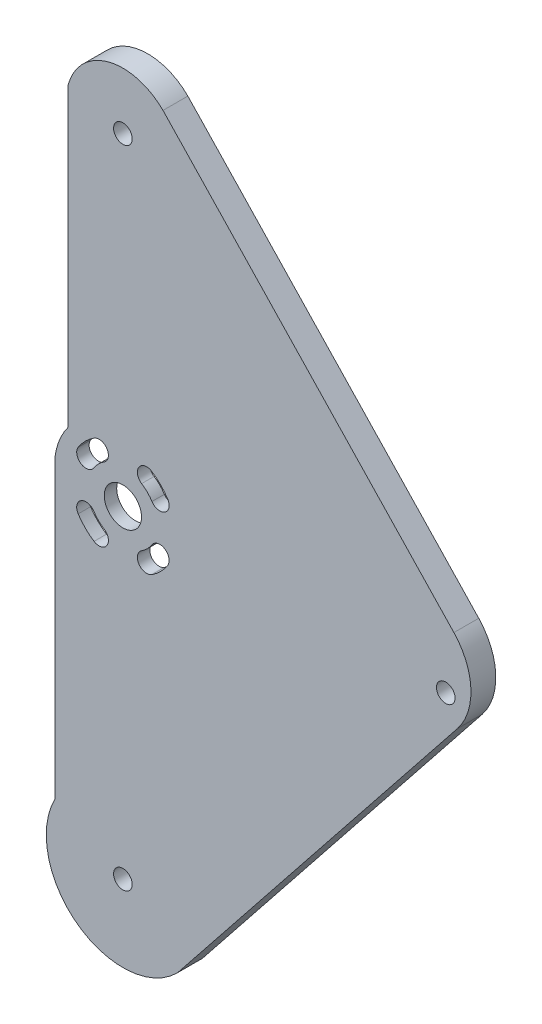
ISO-10303-21;
HEADER;
FILE_DESCRIPTION(('STEP AP214'),'2;1');
FILE_NAME('part.step','',(''),(''),'','','');
FILE_SCHEMA(('AUTOMOTIVE_DESIGN { 1 0 10303 214 1 1 1 1 }'));
ENDSEC;
DATA;
#1=APPLICATION_CONTEXT('core data for automotive mechanical design processes');
#2=APPLICATION_PROTOCOL_DEFINITION('international standard','automotive_design',2000,#1);
#3=PRODUCT_CONTEXT('',#1,'mechanical');
#4=PRODUCT('Part','Part','',(#3));
#5=PRODUCT_RELATED_PRODUCT_CATEGORY('part','',(#4));
#6=PRODUCT_DEFINITION_FORMATION('','',#4);
#7=PRODUCT_DEFINITION_CONTEXT('part definition',#1,'design');
#8=PRODUCT_DEFINITION('design','',#6,#7);
#9=PRODUCT_DEFINITION_SHAPE('','',#8);
#10=(LENGTH_UNIT() NAMED_UNIT(*) SI_UNIT(.MILLI.,.METRE.));
#11=(NAMED_UNIT(*) PLANE_ANGLE_UNIT() SI_UNIT($,.RADIAN.));
#12=(NAMED_UNIT(*) SI_UNIT($,.STERADIAN.) SOLID_ANGLE_UNIT());
#13=UNCERTAINTY_MEASURE_WITH_UNIT(LENGTH_MEASURE(1.E-05),#10,'distance_accuracy_value','');
#14=(GEOMETRIC_REPRESENTATION_CONTEXT(3) GLOBAL_UNCERTAINTY_ASSIGNED_CONTEXT((#13)) GLOBAL_UNIT_ASSIGNED_CONTEXT((#10,
#11,#12)) REPRESENTATION_CONTEXT('',''));
#15=CARTESIAN_POINT('',(0.,0.,0.));
#16=DIRECTION('',(0.,0.,1.));
#17=DIRECTION('',(1.,0.,0.));
#18=AXIS2_PLACEMENT_3D('',#15,#16,#17);
#19=CARTESIAN_POINT('',(1800.79736778428,1508.01201199318,0.));
#20=DIRECTION('',(0.,0.,1.));
#21=DIRECTION('',(1.,0.,0.));
#22=AXIS2_PLACEMENT_3D('',#19,#20,#21);
#23=PLANE('',#22);
#24=CARTESIAN_POINT('',(1800.79736778428,1508.01201199318,0.));
#25=DIRECTION('',(0.,0.,1.));
#26=DIRECTION('',(1.,0.,0.));
#27=AXIS2_PLACEMENT_3D('',#24,#25,#26);
#28=CIRCLE('',#27,1.50000000000011);
#29=CARTESIAN_POINT('',(1802.29736778428,1508.01201199318,0.));
#30=VERTEX_POINT('',#29);
#31=EDGE_CURVE('E520',#30,#30,#28,.T.);
#32=ORIENTED_EDGE('',*,*,#31,.T.);
#33=EDGE_LOOP('',(#32));
#34=FACE_BOUND('',#33,.T.);
#35=CARTESIAN_POINT('',(1852.79736778428,1560.01201199318,0.));
#36=DIRECTION('',(0.,0.,1.));
#37=DIRECTION('',(1.,0.,0.));
#38=AXIS2_PLACEMENT_3D('',#35,#36,#37);
#39=CIRCLE('',#38,1.50000000000011);
#40=CARTESIAN_POINT('',(1854.29736778428,1560.01201199318,0.));
#41=VERTEX_POINT('',#40);
#42=EDGE_CURVE('E525',#41,#41,#39,.T.);
#43=ORIENTED_EDGE('',*,*,#42,.T.);
#44=EDGE_LOOP('',(#43));
#45=FACE_BOUND('',#44,.T.);
#46=CARTESIAN_POINT('',(1800.79736778428,1612.01201199318,0.));
#47=DIRECTION('',(0.,0.,1.));
#48=DIRECTION('',(1.,0.,0.));
#49=AXIS2_PLACEMENT_3D('',#46,#47,#48);
#50=CIRCLE('',#49,1.50000000000011);
#51=CARTESIAN_POINT('',(1802.29736778428,1612.01201199318,0.));
#52=VERTEX_POINT('',#51);
#53=EDGE_CURVE('E530',#52,#52,#50,.T.);
#54=ORIENTED_EDGE('',*,*,#53,.T.);
#55=EDGE_LOOP('',(#54));
#56=FACE_BOUND('',#55,.T.);
#57=DIRECTION('',(-0.688099460960638,0.72561638062111,0.));
#58=VECTOR('',#57,1.);
#59=CARTESIAN_POINT('',(1807.2571027578,1618.4717469667,0.));
#60=LINE('',#59,#58);
#61=CARTESIAN_POINT('',(1854.11125712846,1569.0629858204,0.));
#62=VERTEX_POINT('',#61);
#63=CARTESIAN_POINT('',(1807.2571027578,1618.4717469667,0.));
#64=VERTEX_POINT('',#63);
#65=EDGE_CURVE('E251',#62,#64,#60,.T.);
#66=ORIENTED_EDGE('',*,*,#65,.F.);
#67=CARTESIAN_POINT('',(1846.85509332225,1562.1819912108,0.));
#68=DIRECTION('',(0.,0.,1.));
#69=DIRECTION('',(1.,0.,0.));
#70=AXIS2_PLACEMENT_3D('',#67,#68,#69);
#71=CIRCLE('',#70,10.);
#72=CARTESIAN_POINT('',(1854.67708205086,1555.95170290851,0.));
#73=VERTEX_POINT('',#72);
#74=EDGE_CURVE('E66',#62,#73,#71,.F.);
#75=ORIENTED_EDGE('',*,*,#74,.T.);
#76=DIRECTION('',(0.623028830228245,0.78219887286062,0.));
#77=VECTOR('',#76,1.);
#78=CARTESIAN_POINT('',(1860.09466038913,1562.75335230936,0.));
#79=LINE('',#78,#77);
#80=CARTESIAN_POINT('',(1809.60815906997,1499.36867007555,0.));
#81=VERTEX_POINT('',#80);
#82=EDGE_CURVE('E321',#81,#73,#79,.T.);
#83=ORIENTED_EDGE('',*,*,#82,.F.);
#84=CARTESIAN_POINT('',(1800.79736778428,1508.01201199318,0.));
#85=DIRECTION('',(0.,0.,1.));
#86=DIRECTION('',(1.,0.,0.));
#87=AXIS2_PLACEMENT_3D('',#84,#85,#86);
#88=CIRCLE('',#87,12.3425039025774);
#89=CARTESIAN_POINT('',(1789.87151518898,1513.75336615843,0.));
#90=VERTEX_POINT('',#89);
#91=EDGE_CURVE('E253',#90,#81,#88,.T.);
#92=ORIENTED_EDGE('',*,*,#91,.F.);
#93=DIRECTION('',(0.,-1.,0.));
#94=VECTOR('',#93,1.);
#95=CARTESIAN_POINT('',(1789.87151518898,1561.50820015436,0.));
#96=LINE('',#95,#94);
#97=CARTESIAN_POINT('',(1789.87151518898,1552.9674577088,0.));
#98=VERTEX_POINT('',#97);
#99=EDGE_CURVE('E236',#98,#90,#96,.T.);
#100=ORIENTED_EDGE('',*,*,#99,.F.);
#101=CARTESIAN_POINT('',(1800.79736778428,1560.01201199318,0.));
#102=DIRECTION('',(0.,0.,-1.));
#103=DIRECTION('',(-1.,0.,0.));
#104=AXIS2_PLACEMENT_3D('',#101,#102,#103);
#105=CIRCLE('',#104,12.9999999999998);
#106=CARTESIAN_POINT('',(1791.97511105901,1569.5601943476,0.));
#107=VERTEX_POINT('',#106);
#108=EDGE_CURVE('E224',#107,#98,#105,.T.);
#109=ORIENTED_EDGE('',*,*,#108,.F.);
#110=DIRECTION('',(0.,-1.,0.));
#111=VECTOR('',#110,1.);
#112=CARTESIAN_POINT('',(1791.97511105901,1614.38353853308,0.));
#113=LINE('',#112,#111);
#114=CARTESIAN_POINT('',(1791.97511105901,1614.38353853308,0.));
#115=VERTEX_POINT('',#114);
#116=EDGE_CURVE('E237',#115,#107,#113,.T.);
#117=ORIENTED_EDGE('',*,*,#116,.F.);
#118=CARTESIAN_POINT('',(1800.79736778428,1612.01201199318,0.));
#119=DIRECTION('',(0.,0.,1.));
#120=DIRECTION('',(1.,0.,0.));
#121=AXIS2_PLACEMENT_3D('',#118,#119,#120);
#122=CIRCLE('',#121,9.13544480888525);
#123=EDGE_CURVE('E250',#64,#115,#122,.T.);
#124=ORIENTED_EDGE('',*,*,#123,.F.);
#125=EDGE_LOOP('',(#66,#75,#83,#92,#100,#109,#117,#124));
#126=FACE_BOUND('',#125,.T.);
#127=ADVANCED_FACE('F44',(#34,#45,#56,#126),#23,.F.);
#128=CARTESIAN_POINT('',(1800.79736778428,1560.01201199318,4.));
#129=DIRECTION('',(0.,0.,-1.));
#130=DIRECTION('',(-1.,0.,0.));
#131=AXIS2_PLACEMENT_3D('',#128,#129,#130);
#132=CYLINDRICAL_SURFACE('',#131,11.0278209065997);
#133=CARTESIAN_POINT('',(1800.79736778428,1560.01201199318,2.));
#134=DIRECTION('',(0.,0.,-1.));
#135=DIRECTION('',(-1.,0.,0.));
#136=AXIS2_PLACEMENT_3D('',#133,#134,#135);
#137=CIRCLE('',#136,11.0278209065997);
#138=CARTESIAN_POINT('',(1789.87151518898,1561.50820015436,2.));
#139=VERTEX_POINT('',#138);
#140=CARTESIAN_POINT('',(1791.97511105901,1566.62870453714,2.));
#141=VERTEX_POINT('',#140);
#142=EDGE_CURVE('E386',#139,#141,#137,.T.);
#143=ORIENTED_EDGE('',*,*,#142,.F.);
#144=DIRECTION('',(0.,0.,-1.));
#145=VECTOR('',#144,1.);
#146=CARTESIAN_POINT('',(1789.87151518898,1561.50820015436,4.));
#147=LINE('',#146,#145);
#148=CARTESIAN_POINT('',(1789.87151518898,1561.50820015436,4.));
#149=VERTEX_POINT('',#148);
#150=EDGE_CURVE('E267',#149,#139,#147,.T.);
#151=ORIENTED_EDGE('',*,*,#150,.F.);
#152=CARTESIAN_POINT('',(1800.79736778428,1560.01201199318,4.));
#153=DIRECTION('',(0.,0.,1.));
#154=DIRECTION('',(1.,0.,0.));
#155=AXIS2_PLACEMENT_3D('',#152,#153,#154);
#156=CIRCLE('',#155,11.0278209065997);
#157=CARTESIAN_POINT('',(1791.97511105901,1566.62870453714,4.));
#158=VERTEX_POINT('',#157);
#159=EDGE_CURVE('E303',#158,#149,#156,.T.);
#160=ORIENTED_EDGE('',*,*,#159,.F.);
#161=DIRECTION('',(0.,0.,-1.));
#162=VECTOR('',#161,1.);
#163=CARTESIAN_POINT('',(1791.97511105901,1566.62870453714,4.));
#164=LINE('',#163,#162);
#165=EDGE_CURVE('E272',#158,#141,#164,.T.);
#166=ORIENTED_EDGE('',*,*,#165,.T.);
#167=EDGE_LOOP('',(#143,#151,#160,#166));
#168=FACE_BOUND('',#167,.T.);
#169=ADVANCED_FACE('F342',(#168),#132,.T.);
#170=CARTESIAN_POINT('',(1800.79736778428,1560.01201199318,4.));
#171=DIRECTION('',(0.,0.,-1.));
#172=DIRECTION('',(-1.,0.,0.));
#173=AXIS2_PLACEMENT_3D('',#170,#171,#172);
#174=CYLINDRICAL_SURFACE('',#173,2.99999999999994);
#175=CARTESIAN_POINT('',(1800.79736778428,1560.01201199318,4.));
#176=DIRECTION('',(0.,0.,1.));
#177=DIRECTION('',(1.,0.,0.));
#178=AXIS2_PLACEMENT_3D('',#175,#176,#177);
#179=CIRCLE('',#178,2.99999999999994);
#180=CARTESIAN_POINT('',(1803.79736778428,1560.01201199318,4.));
#181=VERTEX_POINT('',#180);
#182=EDGE_CURVE('E318',#181,#181,#179,.T.);
#183=ORIENTED_EDGE('',*,*,#182,.T.);
#184=EDGE_LOOP('',(#183));
#185=FACE_BOUND('',#184,.T.);
#186=CARTESIAN_POINT('',(1800.79736778428,1560.01201199318,2.));
#187=DIRECTION('',(0.,0.,-1.));
#188=DIRECTION('',(-1.,0.,0.));
#189=AXIS2_PLACEMENT_3D('',#186,#187,#188);
#190=CIRCLE('',#189,2.99999999999994);
#191=CARTESIAN_POINT('',(1797.79736778428,1560.01201199318,2.));
#192=VERTEX_POINT('',#191);
#193=EDGE_CURVE('E388',#192,#192,#190,.T.);
#194=ORIENTED_EDGE('',*,*,#193,.T.);
#195=EDGE_LOOP('',(#194));
#196=FACE_BOUND('',#195,.T.);
#197=ADVANCED_FACE('F355',(#185,#196),#174,.F.);
#198=CARTESIAN_POINT('',(1804.630190701,1554.0698349099,4.));
#199=DIRECTION('',(0.,0.,-1.));
#200=DIRECTION('',(-1.,0.,0.));
#201=AXIS2_PLACEMENT_3D('',#198,#199,#200);
#202=CYLINDRICAL_SURFACE('',#201,1.49999999999997);
#203=DIRECTION('',(0.,0.,-1.));
#204=VECTOR('',#203,1.);
#205=CARTESIAN_POINT('',(1805.44325522365,1552.80930879672,4.));
#206=LINE('',#205,#204);
#207=CARTESIAN_POINT('',(1805.44325522365,1552.80930879672,4.));
#208=VERTEX_POINT('',#207);
#209=CARTESIAN_POINT('',(1805.44325522365,1552.80930879672,2.));
#210=VERTEX_POINT('',#209);
#211=EDGE_CURVE('E511',#208,#210,#206,.T.);
#212=ORIENTED_EDGE('',*,*,#211,.T.);
#213=CARTESIAN_POINT('',(1804.630190701,1554.0698349099,2.));
#214=DIRECTION('',(0.,0.,-1.));
#215=DIRECTION('',(-1.,0.,0.));
#216=AXIS2_PLACEMENT_3D('',#213,#214,#215);
#217=CIRCLE('',#216,1.49999999999997);
#218=CARTESIAN_POINT('',(1803.81712617835,1555.33036102308,2.));
#219=VERTEX_POINT('',#218);
#220=EDGE_CURVE('E398',#210,#219,#217,.T.);
#221=ORIENTED_EDGE('',*,*,#220,.T.);
#222=DIRECTION('',(0.,0.,-1.));
#223=VECTOR('',#222,1.);
#224=CARTESIAN_POINT('',(1803.81712617835,1555.33036102308,4.));
#225=LINE('',#224,#223);
#226=CARTESIAN_POINT('',(1803.81712617835,1555.33036102308,4.));
#227=VERTEX_POINT('',#226);
#228=EDGE_CURVE('E503',#227,#219,#225,.T.);
#229=ORIENTED_EDGE('',*,*,#228,.F.);
#230=CARTESIAN_POINT('',(1804.630190701,1554.0698349099,4.));
#231=DIRECTION('',(0.,0.,1.));
#232=DIRECTION('',(1.,0.,0.));
#233=AXIS2_PLACEMENT_3D('',#230,#231,#232);
#234=CIRCLE('',#233,1.49999999999997);
#235=EDGE_CURVE('E488',#227,#208,#234,.T.);
#236=ORIENTED_EDGE('',*,*,#235,.T.);
#237=EDGE_LOOP('',(#212,#221,#229,#236));
#238=FACE_BOUND('',#237,.T.);
#239=ADVANCED_FACE('F554',(#238),#202,.F.);
#240=CARTESIAN_POINT('',(1800.79736778428,1560.01201199318,4.));
#241=DIRECTION('',(0.,0.,-1.));
#242=DIRECTION('',(-1.,0.,0.));
#243=AXIS2_PLACEMENT_3D('',#240,#241,#242);
#244=CYLINDRICAL_SURFACE('',#243,8.57106781186541);
#245=DIRECTION('',(0.,0.,-1.));
#246=VECTOR('',#245,1.);
#247=CARTESIAN_POINT('',(1808.00007098075,1555.36612455382,4.));
#248=LINE('',#247,#246);
#249=CARTESIAN_POINT('',(1808.00007098075,1555.36612455382,4.));
#250=VERTEX_POINT('',#249);
#251=CARTESIAN_POINT('',(1808.00007098075,1555.36612455382,2.));
#252=VERTEX_POINT('',#251);
#253=EDGE_CURVE('E509',#250,#252,#248,.T.);
#254=ORIENTED_EDGE('',*,*,#253,.T.);
#255=CARTESIAN_POINT('',(1800.79736778428,1560.01201199318,2.));
#256=DIRECTION('',(0.,0.,-1.));
#257=DIRECTION('',(-1.,0.,0.));
#258=AXIS2_PLACEMENT_3D('',#255,#256,#257);
#259=CIRCLE('',#258,8.57106781186541);
#260=EDGE_CURVE('E625',#252,#210,#259,.T.);
#261=ORIENTED_EDGE('',*,*,#260,.T.);
#262=ORIENTED_EDGE('',*,*,#211,.F.);
#263=CARTESIAN_POINT('',(1800.79736778428,1560.01201199318,4.));
#264=DIRECTION('',(0.,0.,1.));
#265=DIRECTION('',(1.,0.,0.));
#266=AXIS2_PLACEMENT_3D('',#263,#264,#265);
#267=CIRCLE('',#266,8.57106781186541);
#268=EDGE_CURVE('E491',#208,#250,#267,.T.);
#269=ORIENTED_EDGE('',*,*,#268,.T.);
#270=EDGE_LOOP('',(#254,#261,#262,#269));
#271=FACE_BOUND('',#270,.T.);
#272=ADVANCED_FACE('F556',(#271),#244,.F.);
#273=CARTESIAN_POINT('',(1806.73954486757,1556.17918907647,4.));
#274=DIRECTION('',(0.,0.,-1.));
#275=DIRECTION('',(-1.,0.,0.));
#276=AXIS2_PLACEMENT_3D('',#273,#274,#275);
#277=CYLINDRICAL_SURFACE('',#276,1.49999999999997);
#278=DIRECTION('',(0.,0.,-1.));
#279=VECTOR('',#278,1.);
#280=CARTESIAN_POINT('',(1805.47901875439,1556.99225359912,4.));
#281=LINE('',#280,#279);
#282=CARTESIAN_POINT('',(1805.47901875439,1556.99225359912,4.));
#283=VERTEX_POINT('',#282);
#284=CARTESIAN_POINT('',(1805.47901875439,1556.99225359912,2.));
#285=VERTEX_POINT('',#284);
#286=EDGE_CURVE('E502',#283,#285,#281,.T.);
#287=ORIENTED_EDGE('',*,*,#286,.T.);
#288=CARTESIAN_POINT('',(1806.73954486757,1556.17918907647,2.));
#289=DIRECTION('',(0.,0.,-1.));
#290=DIRECTION('',(-1.,0.,0.));
#291=AXIS2_PLACEMENT_3D('',#288,#289,#290);
#292=CIRCLE('',#291,1.49999999999997);
#293=EDGE_CURVE('E616',#285,#252,#292,.T.);
#294=ORIENTED_EDGE('',*,*,#293,.T.);
#295=ORIENTED_EDGE('',*,*,#253,.F.);
#296=CARTESIAN_POINT('',(1806.73954486757,1556.17918907647,4.));
#297=DIRECTION('',(0.,0.,1.));
#298=DIRECTION('',(1.,0.,0.));
#299=AXIS2_PLACEMENT_3D('',#296,#297,#298);
#300=CIRCLE('',#299,1.49999999999997);
#301=EDGE_CURVE('E493',#250,#283,#300,.T.);
#302=ORIENTED_EDGE('',*,*,#301,.T.);
#303=EDGE_LOOP('',(#287,#294,#295,#302));
#304=FACE_BOUND('',#303,.T.);
#305=ADVANCED_FACE('F643',(#304),#277,.F.);
#306=CARTESIAN_POINT('',(1800.79736778428,1560.01201199318,4.));
#307=DIRECTION('',(0.,0.,-1.));
#308=DIRECTION('',(-1.,0.,0.));
#309=AXIS2_PLACEMENT_3D('',#306,#307,#308);
#310=CYLINDRICAL_SURFACE('',#309,5.57106781186547);
#311=ORIENTED_EDGE('',*,*,#228,.T.);
#312=CARTESIAN_POINT('',(1800.79736778428,1560.01201199318,2.));
#313=DIRECTION('',(0.,0.,-1.));
#314=DIRECTION('',(-1.,0.,0.));
#315=AXIS2_PLACEMENT_3D('',#312,#313,#314);
#316=CIRCLE('',#315,5.57106781186547);
#317=EDGE_CURVE('E614',#219,#285,#316,.F.);
#318=ORIENTED_EDGE('',*,*,#317,.T.);
#319=ORIENTED_EDGE('',*,*,#286,.F.);
#320=CARTESIAN_POINT('',(1800.79736778428,1560.01201199318,4.));
#321=DIRECTION('',(0.,0.,-1.));
#322=DIRECTION('',(1.,0.,0.));
#323=AXIS2_PLACEMENT_3D('',#320,#321,#322);
#324=CIRCLE('',#323,5.57106781186547);
#325=EDGE_CURVE('E499',#283,#227,#324,.T.);
#326=ORIENTED_EDGE('',*,*,#325,.T.);
#327=EDGE_LOOP('',(#311,#318,#319,#326));
#328=FACE_BOUND('',#327,.T.);
#329=ADVANCED_FACE('F635',(#328),#310,.T.);
#330=CARTESIAN_POINT('',(1806.73954486757,1563.8448349099,4.));
#331=DIRECTION('',(0.,0.,-1.));
#332=DIRECTION('',(-1.,0.,0.));
#333=AXIS2_PLACEMENT_3D('',#330,#331,#332);
#334=CYLINDRICAL_SURFACE('',#333,1.49999999999997);
#335=DIRECTION('',(0.,0.,-1.));
#336=VECTOR('',#335,1.);
#337=CARTESIAN_POINT('',(1808.00007098075,1564.65789943255,4.));
#338=LINE('',#337,#336);
#339=CARTESIAN_POINT('',(1808.00007098075,1564.65789943255,4.));
#340=VERTEX_POINT('',#339);
#341=CARTESIAN_POINT('',(1808.00007098075,1564.65789943255,2.));
#342=VERTEX_POINT('',#341);
#343=EDGE_CURVE('E482',#340,#342,#338,.T.);
#344=ORIENTED_EDGE('',*,*,#343,.T.);
#345=CARTESIAN_POINT('',(1806.73954486757,1563.8448349099,2.));
#346=DIRECTION('',(0.,0.,-1.));
#347=DIRECTION('',(-1.,0.,0.));
#348=AXIS2_PLACEMENT_3D('',#345,#346,#347);
#349=CIRCLE('',#348,1.49999999999997);
#350=CARTESIAN_POINT('',(1805.47901875439,1563.03177038725,2.));
#351=VERTEX_POINT('',#350);
#352=EDGE_CURVE('E608',#342,#351,#349,.T.);
#353=ORIENTED_EDGE('',*,*,#352,.T.);
#354=DIRECTION('',(0.,0.,-1.));
#355=VECTOR('',#354,1.);
#356=CARTESIAN_POINT('',(1805.47901875439,1563.03177038725,4.));
#357=LINE('',#356,#355);
#358=CARTESIAN_POINT('',(1805.47901875439,1563.03177038725,4.));
#359=VERTEX_POINT('',#358);
#360=EDGE_CURVE('E472',#359,#351,#357,.T.);
#361=ORIENTED_EDGE('',*,*,#360,.F.);
#362=CARTESIAN_POINT('',(1806.73954486757,1563.8448349099,4.));
#363=DIRECTION('',(0.,0.,1.));
#364=DIRECTION('',(1.,0.,0.));
#365=AXIS2_PLACEMENT_3D('',#362,#363,#364);
#366=CIRCLE('',#365,1.49999999999997);
#367=EDGE_CURVE('E459',#359,#340,#366,.T.);
#368=ORIENTED_EDGE('',*,*,#367,.T.);
#369=EDGE_LOOP('',(#344,#353,#361,#368));
#370=FACE_BOUND('',#369,.T.);
#371=ADVANCED_FACE('F648',(#370),#334,.F.);
#372=CARTESIAN_POINT('',(1800.79736778428,1560.01201199318,4.));
#373=DIRECTION('',(0.,0.,-1.));
#374=DIRECTION('',(-1.,0.,0.));
#375=AXIS2_PLACEMENT_3D('',#372,#373,#374);
#376=CYLINDRICAL_SURFACE('',#375,8.57106781186545);
#377=DIRECTION('',(0.,0.,-1.));
#378=VECTOR('',#377,1.);
#379=CARTESIAN_POINT('',(1805.44325522365,1567.21471518965,4.));
#380=LINE('',#379,#378);
#381=CARTESIAN_POINT('',(1805.44325522365,1567.21471518965,4.));
#382=VERTEX_POINT('',#381);
#383=CARTESIAN_POINT('',(1805.44325522365,1567.21471518965,2.));
#384=VERTEX_POINT('',#383);
#385=EDGE_CURVE('E477',#382,#384,#380,.T.);
#386=ORIENTED_EDGE('',*,*,#385,.T.);
#387=CARTESIAN_POINT('',(1800.79736778428,1560.01201199318,2.));
#388=DIRECTION('',(0.,0.,-1.));
#389=DIRECTION('',(-1.,0.,0.));
#390=AXIS2_PLACEMENT_3D('',#387,#388,#389);
#391=CIRCLE('',#390,8.57106781186545);
#392=EDGE_CURVE('E607',#384,#342,#391,.T.);
#393=ORIENTED_EDGE('',*,*,#392,.T.);
#394=ORIENTED_EDGE('',*,*,#343,.F.);
#395=CARTESIAN_POINT('',(1800.79736778428,1560.01201199318,4.));
#396=DIRECTION('',(0.,0.,1.));
#397=DIRECTION('',(1.,0.,0.));
#398=AXIS2_PLACEMENT_3D('',#395,#396,#397);
#399=CIRCLE('',#398,8.57106781186545);
#400=EDGE_CURVE('E465',#340,#382,#399,.T.);
#401=ORIENTED_EDGE('',*,*,#400,.T.);
#402=EDGE_LOOP('',(#386,#393,#394,#401));
#403=FACE_BOUND('',#402,.T.);
#404=ADVANCED_FACE('F703',(#403),#376,.F.);
#405=CARTESIAN_POINT('',(1804.630190701,1565.95418907647,4.));
#406=DIRECTION('',(0.,0.,-1.));
#407=DIRECTION('',(-1.,0.,0.));
#408=AXIS2_PLACEMENT_3D('',#405,#406,#407);
#409=CYLINDRICAL_SURFACE('',#408,1.49999999999997);
#410=DIRECTION('',(0.,0.,-1.));
#411=VECTOR('',#410,1.);
#412=CARTESIAN_POINT('',(1803.81712617835,1564.69366296329,4.));
#413=LINE('',#412,#411);
#414=CARTESIAN_POINT('',(1803.81712617835,1564.69366296329,4.));
#415=VERTEX_POINT('',#414);
#416=CARTESIAN_POINT('',(1803.81712617835,1564.69366296329,2.));
#417=VERTEX_POINT('',#416);
#418=EDGE_CURVE('E478',#415,#417,#413,.T.);
#419=ORIENTED_EDGE('',*,*,#418,.T.);
#420=CARTESIAN_POINT('',(1804.630190701,1565.95418907647,2.));
#421=DIRECTION('',(0.,0.,-1.));
#422=DIRECTION('',(-1.,0.,0.));
#423=AXIS2_PLACEMENT_3D('',#420,#421,#422);
#424=CIRCLE('',#423,1.49999999999997);
#425=EDGE_CURVE('E605',#417,#384,#424,.T.);
#426=ORIENTED_EDGE('',*,*,#425,.T.);
#427=ORIENTED_EDGE('',*,*,#385,.F.);
#428=CARTESIAN_POINT('',(1804.630190701,1565.95418907647,4.));
#429=DIRECTION('',(0.,0.,1.));
#430=DIRECTION('',(1.,0.,0.));
#431=AXIS2_PLACEMENT_3D('',#428,#429,#430);
#432=CIRCLE('',#431,1.49999999999997);
#433=EDGE_CURVE('E462',#382,#415,#432,.T.);
#434=ORIENTED_EDGE('',*,*,#433,.T.);
#435=EDGE_LOOP('',(#419,#426,#427,#434));
#436=FACE_BOUND('',#435,.T.);
#437=ADVANCED_FACE('F699',(#436),#409,.F.);
#438=CARTESIAN_POINT('',(1800.79736778428,1560.01201199318,4.));
#439=DIRECTION('',(0.,0.,-1.));
#440=DIRECTION('',(-1.,0.,0.));
#441=AXIS2_PLACEMENT_3D('',#438,#439,#440);
#442=CYLINDRICAL_SURFACE('',#441,5.57106781186551);
#443=ORIENTED_EDGE('',*,*,#360,.T.);
#444=CARTESIAN_POINT('',(1800.79736778428,1560.01201199318,2.));
#445=DIRECTION('',(0.,0.,-1.));
#446=DIRECTION('',(-1.,0.,0.));
#447=AXIS2_PLACEMENT_3D('',#444,#445,#446);
#448=CIRCLE('',#447,5.57106781186551);
#449=EDGE_CURVE('E598',#351,#417,#448,.F.);
#450=ORIENTED_EDGE('',*,*,#449,.T.);
#451=ORIENTED_EDGE('',*,*,#418,.F.);
#452=CARTESIAN_POINT('',(1800.79736778428,1560.01201199318,4.));
#453=DIRECTION('',(0.,0.,-1.));
#454=DIRECTION('',(1.,0.,0.));
#455=AXIS2_PLACEMENT_3D('',#452,#453,#454);
#456=CIRCLE('',#455,5.57106781186551);
#457=EDGE_CURVE('E469',#415,#359,#456,.T.);
#458=ORIENTED_EDGE('',*,*,#457,.T.);
#459=EDGE_LOOP('',(#443,#450,#451,#458));
#460=FACE_BOUND('',#459,.T.);
#461=ADVANCED_FACE('F694',(#460),#442,.T.);
#462=CARTESIAN_POINT('',(1796.96454486757,1565.95418907647,4.));
#463=DIRECTION('',(0.,0.,-1.));
#464=DIRECTION('',(-1.,0.,0.));
#465=AXIS2_PLACEMENT_3D('',#462,#463,#464);
#466=CYLINDRICAL_SURFACE('',#465,1.50000000000012);
#467=DIRECTION('',(0.,0.,-1.));
#468=VECTOR('',#467,1.);
#469=CARTESIAN_POINT('',(1796.15148034492,1567.21471518965,4.));
#470=LINE('',#469,#468);
#471=CARTESIAN_POINT('',(1796.15148034492,1567.21471518965,4.));
#472=VERTEX_POINT('',#471);
#473=CARTESIAN_POINT('',(1796.15148034492,1567.21471518965,2.));
#474=VERTEX_POINT('',#473);
#475=EDGE_CURVE('E452',#472,#474,#470,.T.);
#476=ORIENTED_EDGE('',*,*,#475,.T.);
#477=CARTESIAN_POINT('',(1796.96454486757,1565.95418907647,2.));
#478=DIRECTION('',(0.,0.,-1.));
#479=DIRECTION('',(-1.,0.,0.));
#480=AXIS2_PLACEMENT_3D('',#477,#478,#479);
#481=CIRCLE('',#480,1.50000000000012);
#482=CARTESIAN_POINT('',(1797.77760939022,1564.69366296329,2.));
#483=VERTEX_POINT('',#482);
#484=EDGE_CURVE('E592',#474,#483,#481,.T.);
#485=ORIENTED_EDGE('',*,*,#484,.T.);
#486=DIRECTION('',(0.,0.,-1.));
#487=VECTOR('',#486,1.);
#488=CARTESIAN_POINT('',(1797.77760939022,1564.69366296329,4.));
#489=LINE('',#488,#487);
#490=CARTESIAN_POINT('',(1797.77760939022,1564.69366296329,4.));
#491=VERTEX_POINT('',#490);
#492=EDGE_CURVE('E444',#491,#483,#489,.T.);
#493=ORIENTED_EDGE('',*,*,#492,.F.);
#494=CARTESIAN_POINT('',(1796.96454486757,1565.95418907647,4.));
#495=DIRECTION('',(0.,0.,1.));
#496=DIRECTION('',(1.,0.,0.));
#497=AXIS2_PLACEMENT_3D('',#494,#495,#496);
#498=CIRCLE('',#497,1.50000000000012);
#499=EDGE_CURVE('E429',#491,#472,#498,.T.);
#500=ORIENTED_EDGE('',*,*,#499,.T.);
#501=EDGE_LOOP('',(#476,#485,#493,#500));
#502=FACE_BOUND('',#501,.T.);
#503=ADVANCED_FACE('F693',(#502),#466,.F.);
#504=CARTESIAN_POINT('',(1800.79736778428,1560.01201199318,4.));
#505=DIRECTION('',(0.,0.,-1.));
#506=DIRECTION('',(-1.,0.,0.));
#507=AXIS2_PLACEMENT_3D('',#504,#505,#506);
#508=CYLINDRICAL_SURFACE('',#507,8.5710678118659);
#509=DIRECTION('',(0.,0.,-1.));
#510=VECTOR('',#509,1.);
#511=CARTESIAN_POINT('',(1793.59466458782,1564.65789943255,4.));
#512=LINE('',#511,#510);
#513=CARTESIAN_POINT('',(1793.59466458782,1564.65789943255,4.));
#514=VERTEX_POINT('',#513);
#515=CARTESIAN_POINT('',(1793.59466458782,1564.65789943255,2.));
#516=VERTEX_POINT('',#515);
#517=EDGE_CURVE('E453',#514,#516,#512,.T.);
#518=ORIENTED_EDGE('',*,*,#517,.T.);
#519=CARTESIAN_POINT('',(1800.79736778428,1560.01201199318,2.));
#520=DIRECTION('',(0.,0.,-1.));
#521=DIRECTION('',(-1.,0.,0.));
#522=AXIS2_PLACEMENT_3D('',#519,#520,#521);
#523=CIRCLE('',#522,8.5710678118659);
#524=EDGE_CURVE('E587',#516,#474,#523,.T.);
#525=ORIENTED_EDGE('',*,*,#524,.T.);
#526=ORIENTED_EDGE('',*,*,#475,.F.);
#527=CARTESIAN_POINT('',(1800.79736778428,1560.01201199318,4.));
#528=DIRECTION('',(0.,0.,1.));
#529=DIRECTION('',(1.,0.,0.));
#530=AXIS2_PLACEMENT_3D('',#527,#528,#529);
#531=CIRCLE('',#530,8.5710678118659);
#532=EDGE_CURVE('E433',#472,#514,#531,.T.);
#533=ORIENTED_EDGE('',*,*,#532,.T.);
#534=EDGE_LOOP('',(#518,#525,#526,#533));
#535=FACE_BOUND('',#534,.T.);
#536=ADVANCED_FACE('F690',(#535),#508,.F.);
#537=CARTESIAN_POINT('',(1794.855190701,1563.8448349099,4.));
#538=DIRECTION('',(0.,0.,-1.));
#539=DIRECTION('',(-1.,0.,0.));
#540=AXIS2_PLACEMENT_3D('',#537,#538,#539);
#541=CYLINDRICAL_SURFACE('',#540,1.50000000000012);
#542=DIRECTION('',(0.,0.,-1.));
#543=VECTOR('',#542,1.);
#544=CARTESIAN_POINT('',(1796.11571681418,1563.03177038725,4.));
#545=LINE('',#544,#543);
#546=CARTESIAN_POINT('',(1796.11571681418,1563.03177038725,4.));
#547=VERTEX_POINT('',#546);
#548=CARTESIAN_POINT('',(1796.11571681418,1563.03177038725,2.));
#549=VERTEX_POINT('',#548);
#550=EDGE_CURVE('E450',#547,#549,#545,.T.);
#551=ORIENTED_EDGE('',*,*,#550,.T.);
#552=CARTESIAN_POINT('',(1794.855190701,1563.8448349099,2.));
#553=DIRECTION('',(0.,0.,-1.));
#554=DIRECTION('',(-1.,0.,0.));
#555=AXIS2_PLACEMENT_3D('',#552,#553,#554);
#556=CIRCLE('',#555,1.50000000000012);
#557=EDGE_CURVE('E588',#549,#516,#556,.T.);
#558=ORIENTED_EDGE('',*,*,#557,.T.);
#559=ORIENTED_EDGE('',*,*,#517,.F.);
#560=CARTESIAN_POINT('',(1794.855190701,1563.8448349099,4.));
#561=DIRECTION('',(0.,0.,1.));
#562=DIRECTION('',(1.,0.,0.));
#563=AXIS2_PLACEMENT_3D('',#560,#561,#562);
#564=CIRCLE('',#563,1.50000000000012);
#565=EDGE_CURVE('E436',#514,#547,#564,.T.);
#566=ORIENTED_EDGE('',*,*,#565,.T.);
#567=EDGE_LOOP('',(#551,#558,#559,#566));
#568=FACE_BOUND('',#567,.T.);
#569=ADVANCED_FACE('F681',(#568),#541,.F.);
#570=CARTESIAN_POINT('',(1800.79736778428,1560.01201199318,4.));
#571=DIRECTION('',(0.,0.,-1.));
#572=DIRECTION('',(-1.,0.,0.));
#573=AXIS2_PLACEMENT_3D('',#570,#571,#572);
#574=CYLINDRICAL_SURFACE('',#573,5.57106781186566);
#575=ORIENTED_EDGE('',*,*,#492,.T.);
#576=CARTESIAN_POINT('',(1800.79736778428,1560.01201199318,2.));
#577=DIRECTION('',(0.,0.,-1.));
#578=DIRECTION('',(-1.,0.,0.));
#579=AXIS2_PLACEMENT_3D('',#576,#577,#578);
#580=CIRCLE('',#579,5.57106781186566);
#581=EDGE_CURVE('E582',#483,#549,#580,.F.);
#582=ORIENTED_EDGE('',*,*,#581,.T.);
#583=ORIENTED_EDGE('',*,*,#550,.F.);
#584=CARTESIAN_POINT('',(1800.79736778428,1560.01201199318,4.));
#585=DIRECTION('',(0.,0.,-1.));
#586=DIRECTION('',(1.,0.,0.));
#587=AXIS2_PLACEMENT_3D('',#584,#585,#586);
#588=CIRCLE('',#587,5.57106781186566);
#589=EDGE_CURVE('E439',#547,#491,#588,.T.);
#590=ORIENTED_EDGE('',*,*,#589,.T.);
#591=EDGE_LOOP('',(#575,#582,#583,#590));
#592=FACE_BOUND('',#591,.T.);
#593=ADVANCED_FACE('F679',(#592),#574,.T.);
#594=CARTESIAN_POINT('',(1794.855190701,1556.17918907647,4.));
#595=DIRECTION('',(0.,0.,-1.));
#596=DIRECTION('',(-1.,0.,0.));
#597=AXIS2_PLACEMENT_3D('',#594,#595,#596);
#598=CYLINDRICAL_SURFACE('',#597,1.49999999999982);
#599=DIRECTION('',(0.,0.,-1.));
#600=VECTOR('',#599,1.);
#601=CARTESIAN_POINT('',(1793.59466458782,1555.36612455382,4.));
#602=LINE('',#601,#600);
#603=CARTESIAN_POINT('',(1793.59466458782,1555.36612455382,4.));
#604=VERTEX_POINT('',#603);
#605=CARTESIAN_POINT('',(1793.59466458782,1555.36612455382,2.));
#606=VERTEX_POINT('',#605);
#607=EDGE_CURVE('E426',#604,#606,#602,.T.);
#608=ORIENTED_EDGE('',*,*,#607,.T.);
#609=CARTESIAN_POINT('',(1794.855190701,1556.17918907647,2.));
#610=DIRECTION('',(0.,0.,-1.));
#611=DIRECTION('',(-1.,0.,0.));
#612=AXIS2_PLACEMENT_3D('',#609,#610,#611);
#613=CIRCLE('',#612,1.49999999999982);
#614=CARTESIAN_POINT('',(1796.11571681418,1556.99225359912,2.));
#615=VERTEX_POINT('',#614);
#616=EDGE_CURVE('E576',#606,#615,#613,.T.);
#617=ORIENTED_EDGE('',*,*,#616,.T.);
#618=DIRECTION('',(0.,0.,-1.));
#619=VECTOR('',#618,1.);
#620=CARTESIAN_POINT('',(1796.11571681418,1556.99225359912,4.));
#621=LINE('',#620,#619);
#622=CARTESIAN_POINT('',(1796.11571681418,1556.99225359912,4.));
#623=VERTEX_POINT('',#622);
#624=EDGE_CURVE('E414',#623,#615,#621,.T.);
#625=ORIENTED_EDGE('',*,*,#624,.F.);
#626=CARTESIAN_POINT('',(1794.855190701,1556.17918907647,4.));
#627=DIRECTION('',(0.,0.,1.));
#628=DIRECTION('',(1.,0.,0.));
#629=AXIS2_PLACEMENT_3D('',#626,#627,#628);
#630=CIRCLE('',#629,1.49999999999982);
#631=EDGE_CURVE('E227',#623,#604,#630,.T.);
#632=ORIENTED_EDGE('',*,*,#631,.T.);
#633=EDGE_LOOP('',(#608,#617,#625,#632));
#634=FACE_BOUND('',#633,.T.);
#635=ADVANCED_FACE('F672',(#634),#598,.F.);
#636=CARTESIAN_POINT('',(1800.79736778428,1560.01201199318,4.));
#637=DIRECTION('',(0.,0.,-1.));
#638=DIRECTION('',(-1.,0.,0.));
#639=AXIS2_PLACEMENT_3D('',#636,#637,#638);
#640=CYLINDRICAL_SURFACE('',#639,8.57106781186532);
#641=DIRECTION('',(0.,0.,-1.));
#642=VECTOR('',#641,1.);
#643=CARTESIAN_POINT('',(1796.15148034492,1552.80930879672,4.));
#644=LINE('',#643,#642);
#645=CARTESIAN_POINT('',(1796.15148034492,1552.80930879672,4.));
#646=VERTEX_POINT('',#645);
#647=CARTESIAN_POINT('',(1796.15148034492,1552.80930879672,2.));
#648=VERTEX_POINT('',#647);
#649=EDGE_CURVE('E425',#646,#648,#644,.T.);
#650=ORIENTED_EDGE('',*,*,#649,.T.);
#651=CARTESIAN_POINT('',(1800.79736778428,1560.01201199318,2.));
#652=DIRECTION('',(0.,0.,-1.));
#653=DIRECTION('',(-1.,0.,0.));
#654=AXIS2_PLACEMENT_3D('',#651,#652,#653);
#655=CIRCLE('',#654,8.57106781186532);
#656=EDGE_CURVE('E575',#648,#606,#655,.T.);
#657=ORIENTED_EDGE('',*,*,#656,.T.);
#658=ORIENTED_EDGE('',*,*,#607,.F.);
#659=CARTESIAN_POINT('',(1800.79736778428,1560.01201199318,4.));
#660=DIRECTION('',(0.,0.,1.));
#661=DIRECTION('',(1.,0.,0.));
#662=AXIS2_PLACEMENT_3D('',#659,#660,#661);
#663=CIRCLE('',#662,8.57106781186532);
#664=EDGE_CURVE('E404',#604,#646,#663,.T.);
#665=ORIENTED_EDGE('',*,*,#664,.T.);
#666=EDGE_LOOP('',(#650,#657,#658,#665));
#667=FACE_BOUND('',#666,.T.);
#668=ADVANCED_FACE('F673',(#667),#640,.F.);
#669=CARTESIAN_POINT('',(1796.96454486757,1554.0698349099,4.));
#670=DIRECTION('',(0.,0.,-1.));
#671=DIRECTION('',(-1.,0.,0.));
#672=AXIS2_PLACEMENT_3D('',#669,#670,#671);
#673=CYLINDRICAL_SURFACE('',#672,1.49999999999988);
#674=DIRECTION('',(0.,0.,-1.));
#675=VECTOR('',#674,1.);
#676=CARTESIAN_POINT('',(1797.77760939022,1555.33036102308,4.));
#677=LINE('',#676,#675);
#678=CARTESIAN_POINT('',(1797.77760939022,1555.33036102308,4.));
#679=VERTEX_POINT('',#678);
#680=CARTESIAN_POINT('',(1797.77760939022,1555.33036102308,2.));
#681=VERTEX_POINT('',#680);
#682=EDGE_CURVE('E416',#679,#681,#677,.T.);
#683=ORIENTED_EDGE('',*,*,#682,.T.);
#684=CARTESIAN_POINT('',(1796.96454486757,1554.0698349099,2.));
#685=DIRECTION('',(0.,0.,-1.));
#686=DIRECTION('',(-1.,0.,0.));
#687=AXIS2_PLACEMENT_3D('',#684,#685,#686);
#688=CIRCLE('',#687,1.49999999999988);
#689=EDGE_CURVE('E566',#681,#648,#688,.T.);
#690=ORIENTED_EDGE('',*,*,#689,.T.);
#691=ORIENTED_EDGE('',*,*,#649,.F.);
#692=CARTESIAN_POINT('',(1796.96454486757,1554.0698349099,4.));
#693=DIRECTION('',(0.,0.,1.));
#694=DIRECTION('',(1.,0.,0.));
#695=AXIS2_PLACEMENT_3D('',#692,#693,#694);
#696=CIRCLE('',#695,1.49999999999988);
#697=EDGE_CURVE('E410',#646,#679,#696,.T.);
#698=ORIENTED_EDGE('',*,*,#697,.T.);
#699=EDGE_LOOP('',(#683,#690,#691,#698));
#700=FACE_BOUND('',#699,.T.);
#701=ADVANCED_FACE('F670',(#700),#673,.F.);
#702=CARTESIAN_POINT('',(1800.79736778428,1560.01201199318,4.));
#703=DIRECTION('',(0.,0.,-1.));
#704=DIRECTION('',(-1.,0.,0.));
#705=AXIS2_PLACEMENT_3D('',#702,#703,#704);
#706=CYLINDRICAL_SURFACE('',#705,5.57106781186563);
#707=ORIENTED_EDGE('',*,*,#624,.T.);
#708=CARTESIAN_POINT('',(1800.79736778428,1560.01201199318,2.));
#709=DIRECTION('',(0.,0.,-1.));
#710=DIRECTION('',(-1.,0.,0.));
#711=AXIS2_PLACEMENT_3D('',#708,#709,#710);
#712=CIRCLE('',#711,5.57106781186563);
#713=EDGE_CURVE('E281',#615,#681,#712,.F.);
#714=ORIENTED_EDGE('',*,*,#713,.T.);
#715=ORIENTED_EDGE('',*,*,#682,.F.);
#716=CARTESIAN_POINT('',(1800.79736778428,1560.01201199318,4.));
#717=DIRECTION('',(0.,0.,-1.));
#718=DIRECTION('',(1.,0.,0.));
#719=AXIS2_PLACEMENT_3D('',#716,#717,#718);
#720=CIRCLE('',#719,5.57106781186563);
#721=EDGE_CURVE('E413',#679,#623,#720,.T.);
#722=ORIENTED_EDGE('',*,*,#721,.T.);
#723=EDGE_LOOP('',(#707,#714,#715,#722));
#724=FACE_BOUND('',#723,.T.);
#725=ADVANCED_FACE('F380',(#724),#706,.T.);
#726=CARTESIAN_POINT('',(1800.79736778428,1508.01201199318,4.));
#727=DIRECTION('',(0.,0.,1.));
#728=DIRECTION('',(1.,0.,0.));
#729=AXIS2_PLACEMENT_3D('',#726,#727,#728);
#730=PLANE('',#729);
#731=CARTESIAN_POINT('',(1852.79736778428,1560.01201199318,4.));
#732=DIRECTION('',(0.,0.,1.));
#733=DIRECTION('',(1.,0.,0.));
#734=AXIS2_PLACEMENT_3D('',#731,#732,#733);
#735=CIRCLE('',#734,1.50000000000011);
#736=CARTESIAN_POINT('',(1854.29736778428,1560.01201199318,4.));
#737=VERTEX_POINT('',#736);
#738=EDGE_CURVE('E522',#737,#737,#735,.T.);
#739=ORIENTED_EDGE('',*,*,#738,.F.);
#740=EDGE_LOOP('',(#739));
#741=FACE_BOUND('',#740,.T.);
#742=ORIENTED_EDGE('',*,*,#182,.F.);
#743=EDGE_LOOP('',(#742));
#744=FACE_BOUND('',#743,.T.);
#745=DIRECTION('',(0.623028830228245,0.78219887286062,0.));
#746=VECTOR('',#745,1.);
#747=CARTESIAN_POINT('',(1860.09466038913,1562.75335230936,4.));
#748=LINE('',#747,#746);
#749=CARTESIAN_POINT('',(1809.60815906997,1499.36867007555,4.));
#750=VERTEX_POINT('',#749);
#751=CARTESIAN_POINT('',(1854.67708205086,1555.95170290851,4.));
#752=VERTEX_POINT('',#751);
#753=EDGE_CURVE('E259',#750,#752,#748,.T.);
#754=ORIENTED_EDGE('',*,*,#753,.T.);
#755=CARTESIAN_POINT('',(1846.85509332225,1562.1819912108,4.));
#756=DIRECTION('',(0.,0.,1.));
#757=DIRECTION('',(1.,0.,0.));
#758=AXIS2_PLACEMENT_3D('',#755,#756,#757);
#759=CIRCLE('',#758,10.);
#760=CARTESIAN_POINT('',(1854.11125712846,1569.0629858204,4.));
#761=VERTEX_POINT('',#760);
#762=EDGE_CURVE('E11',#752,#761,#759,.T.);
#763=ORIENTED_EDGE('',*,*,#762,.T.);
#764=DIRECTION('',(-0.688099460960638,0.72561638062111,0.));
#765=VECTOR('',#764,1.);
#766=CARTESIAN_POINT('',(1807.2571027578,1618.4717469667,4.));
#767=LINE('',#766,#765);
#768=CARTESIAN_POINT('',(1807.2571027578,1618.4717469667,4.));
#769=VERTEX_POINT('',#768);
#770=EDGE_CURVE('E309',#761,#769,#767,.T.);
#771=ORIENTED_EDGE('',*,*,#770,.T.);
#772=CARTESIAN_POINT('',(1800.79736778428,1612.01201199318,4.));
#773=DIRECTION('',(0.,0.,1.));
#774=DIRECTION('',(1.,0.,0.));
#775=AXIS2_PLACEMENT_3D('',#772,#773,#774);
#776=CIRCLE('',#775,9.13544480888525);
#777=CARTESIAN_POINT('',(1791.97511105901,1614.38353853308,4.));
#778=VERTEX_POINT('',#777);
#779=EDGE_CURVE('E307',#769,#778,#776,.T.);
#780=ORIENTED_EDGE('',*,*,#779,.T.);
#781=DIRECTION('',(0.,-1.,0.));
#782=VECTOR('',#781,1.);
#783=CARTESIAN_POINT('',(1791.97511105901,1614.38353853308,4.));
#784=LINE('',#783,#782);
#785=EDGE_CURVE('E304',#778,#158,#784,.T.);
#786=ORIENTED_EDGE('',*,*,#785,.T.);
#787=ORIENTED_EDGE('',*,*,#159,.T.);
#788=DIRECTION('',(0.,-1.,0.));
#789=VECTOR('',#788,1.);
#790=CARTESIAN_POINT('',(1789.87151518898,1561.50820015436,4.));
#791=LINE('',#790,#789);
#792=CARTESIAN_POINT('',(1789.87151518898,1513.75336615843,4.));
#793=VERTEX_POINT('',#792);
#794=EDGE_CURVE('E296',#149,#793,#791,.T.);
#795=ORIENTED_EDGE('',*,*,#794,.T.);
#796=CARTESIAN_POINT('',(1800.79736778428,1508.01201199318,4.));
#797=DIRECTION('',(0.,0.,1.));
#798=DIRECTION('',(1.,0.,0.));
#799=AXIS2_PLACEMENT_3D('',#796,#797,#798);
#800=CIRCLE('',#799,12.3425039025774);
#801=EDGE_CURVE('E264',#793,#750,#800,.T.);
#802=ORIENTED_EDGE('',*,*,#801,.T.);
#803=EDGE_LOOP('',(#754,#763,#771,#780,#786,#787,#795,#802));
#804=FACE_BOUND('',#803,.T.);
#805=CARTESIAN_POINT('',(1800.79736778428,1612.01201199318,4.));
#806=DIRECTION('',(0.,0.,1.));
#807=DIRECTION('',(1.,0.,0.));
#808=AXIS2_PLACEMENT_3D('',#805,#806,#807);
#809=CIRCLE('',#808,1.50000000000011);
#810=CARTESIAN_POINT('',(1802.29736778428,1612.01201199318,4.));
#811=VERTEX_POINT('',#810);
#812=EDGE_CURVE('E531',#811,#811,#809,.T.);
#813=ORIENTED_EDGE('',*,*,#812,.F.);
#814=EDGE_LOOP('',(#813));
#815=FACE_BOUND('',#814,.T.);
#816=CARTESIAN_POINT('',(1800.79736778428,1508.01201199318,4.));
#817=DIRECTION('',(0.,0.,1.));
#818=DIRECTION('',(1.,0.,0.));
#819=AXIS2_PLACEMENT_3D('',#816,#817,#818);
#820=CIRCLE('',#819,1.50000000000011);
#821=CARTESIAN_POINT('',(1802.29736778428,1508.01201199318,4.));
#822=VERTEX_POINT('',#821);
#823=EDGE_CURVE('E516',#822,#822,#820,.T.);
#824=ORIENTED_EDGE('',*,*,#823,.F.);
#825=EDGE_LOOP('',(#824));
#826=FACE_BOUND('',#825,.T.);
#827=ORIENTED_EDGE('',*,*,#268,.F.);
#828=ORIENTED_EDGE('',*,*,#235,.F.);
#829=ORIENTED_EDGE('',*,*,#325,.F.);
#830=ORIENTED_EDGE('',*,*,#301,.F.);
#831=EDGE_LOOP('',(#827,#828,#829,#830));
#832=FACE_BOUND('',#831,.T.);
#833=ORIENTED_EDGE('',*,*,#400,.F.);
#834=ORIENTED_EDGE('',*,*,#367,.F.);
#835=ORIENTED_EDGE('',*,*,#457,.F.);
#836=ORIENTED_EDGE('',*,*,#433,.F.);
#837=EDGE_LOOP('',(#833,#834,#835,#836));
#838=FACE_BOUND('',#837,.T.);
#839=ORIENTED_EDGE('',*,*,#532,.F.);
#840=ORIENTED_EDGE('',*,*,#499,.F.);
#841=ORIENTED_EDGE('',*,*,#589,.F.);
#842=ORIENTED_EDGE('',*,*,#565,.F.);
#843=EDGE_LOOP('',(#839,#840,#841,#842));
#844=FACE_BOUND('',#843,.T.);
#845=ORIENTED_EDGE('',*,*,#664,.F.);
#846=ORIENTED_EDGE('',*,*,#631,.F.);
#847=ORIENTED_EDGE('',*,*,#721,.F.);
#848=ORIENTED_EDGE('',*,*,#697,.F.);
#849=EDGE_LOOP('',(#845,#846,#847,#848));
#850=FACE_BOUND('',#849,.T.);
#851=ADVANCED_FACE('F335',(#741,#744,#804,#815,#826,#832,#838,#844,#850),#730,.T.);
#852=CARTESIAN_POINT('',(1860.09466038913,1562.75335230936,4.));
#853=DIRECTION('',(-0.78219887286062,0.623028830228245,0.));
#854=DIRECTION('',(-0.623028830228245,-0.78219887286062,0.));
#855=AXIS2_PLACEMENT_3D('',#852,#853,#854);
#856=PLANE('',#855);
#857=ORIENTED_EDGE('',*,*,#82,.T.);
#858=DIRECTION('',(0.,0.,-1.));
#859=VECTOR('',#858,1.);
#860=CARTESIAN_POINT('',(1854.67708205086,1555.95170290851,4.));
#861=LINE('',#860,#859);
#862=EDGE_CURVE('E53',#73,#752,#861,.F.);
#863=ORIENTED_EDGE('',*,*,#862,.T.);
#864=ORIENTED_EDGE('',*,*,#753,.F.);
#865=DIRECTION('',(0.,0.,-1.));
#866=VECTOR('',#865,1.);
#867=CARTESIAN_POINT('',(1809.60815906997,1499.36867007555,4.));
#868=LINE('',#867,#866);
#869=EDGE_CURVE('E257',#750,#81,#868,.T.);
#870=ORIENTED_EDGE('',*,*,#869,.T.);
#871=EDGE_LOOP('',(#857,#863,#864,#870));
#872=FACE_BOUND('',#871,.T.);
#873=ADVANCED_FACE('F373',(#872),#856,.F.);
#874=CARTESIAN_POINT('',(1807.2571027578,1618.4717469667,4.));
#875=DIRECTION('',(-0.72561638062111,-0.688099460960638,0.));
#876=DIRECTION('',(0.688099460960638,-0.72561638062111,0.));
#877=AXIS2_PLACEMENT_3D('',#874,#875,#876);
#878=PLANE('',#877);
#879=ORIENTED_EDGE('',*,*,#770,.F.);
#880=DIRECTION('',(0.,0.,-1.));
#881=VECTOR('',#880,1.);
#882=CARTESIAN_POINT('',(1854.11125712846,1569.0629858204,4.));
#883=LINE('',#882,#881);
#884=EDGE_CURVE('E287',#761,#62,#883,.T.);
#885=ORIENTED_EDGE('',*,*,#884,.T.);
#886=ORIENTED_EDGE('',*,*,#65,.T.);
#887=DIRECTION('',(0.,0.,-1.));
#888=VECTOR('',#887,1.);
#889=CARTESIAN_POINT('',(1807.2571027578,1618.4717469667,4.));
#890=LINE('',#889,#888);
#891=EDGE_CURVE('E276',#769,#64,#890,.T.);
#892=ORIENTED_EDGE('',*,*,#891,.F.);
#893=EDGE_LOOP('',(#879,#885,#886,#892));
#894=FACE_BOUND('',#893,.T.);
#895=ADVANCED_FACE('F330',(#894),#878,.F.);
#896=CARTESIAN_POINT('',(1800.79736778428,1612.01201199318,4.));
#897=DIRECTION('',(0.,0.,-1.));
#898=DIRECTION('',(-1.,0.,0.));
#899=AXIS2_PLACEMENT_3D('',#896,#897,#898);
#900=CYLINDRICAL_SURFACE('',#899,9.13544480888525);
#901=ORIENTED_EDGE('',*,*,#123,.T.);
#902=DIRECTION('',(0.,0.,-1.));
#903=VECTOR('',#902,1.);
#904=CARTESIAN_POINT('',(1791.97511105901,1614.38353853308,4.));
#905=LINE('',#904,#903);
#906=EDGE_CURVE('E242',#778,#115,#905,.T.);
#907=ORIENTED_EDGE('',*,*,#906,.F.);
#908=ORIENTED_EDGE('',*,*,#779,.F.);
#909=ORIENTED_EDGE('',*,*,#891,.T.);
#910=EDGE_LOOP('',(#901,#907,#908,#909));
#911=FACE_BOUND('',#910,.T.);
#912=ADVANCED_FACE('F332',(#911),#900,.T.);
#913=CARTESIAN_POINT('',(1791.97511105901,1614.38353853308,4.));
#914=DIRECTION('',(1.,0.,0.));
#915=DIRECTION('',(0.,0.,-1.));
#916=AXIS2_PLACEMENT_3D('',#913,#914,#915);
#917=PLANE('',#916);
#918=ORIENTED_EDGE('',*,*,#116,.T.);
#919=DIRECTION('',(0.,0.,-1.));
#920=VECTOR('',#919,1.);
#921=CARTESIAN_POINT('',(1791.97511105901,1569.5601943476,2.));
#922=LINE('',#921,#920);
#923=CARTESIAN_POINT('',(1791.97511105901,1569.5601943476,2.));
#924=VERTEX_POINT('',#923);
#925=EDGE_CURVE('E218',#107,#924,#922,.F.);
#926=ORIENTED_EDGE('',*,*,#925,.T.);
#927=DIRECTION('',(0.,1.,0.));
#928=VECTOR('',#927,1.);
#929=CARTESIAN_POINT('',(1791.97511105901,1614.38353853308,2.));
#930=LINE('',#929,#928);
#931=EDGE_CURVE('E233',#141,#924,#930,.T.);
#932=ORIENTED_EDGE('',*,*,#931,.F.);
#933=ORIENTED_EDGE('',*,*,#165,.F.);
#934=ORIENTED_EDGE('',*,*,#785,.F.);
#935=ORIENTED_EDGE('',*,*,#906,.T.);
#936=EDGE_LOOP('',(#918,#926,#932,#933,#934,#935));
#937=FACE_BOUND('',#936,.T.);
#938=ADVANCED_FACE('F245',(#937),#917,.F.);
#939=CARTESIAN_POINT('',(1789.87151518898,1561.50820015436,4.));
#940=DIRECTION('',(1.,0.,0.));
#941=DIRECTION('',(0.,0.,-1.));
#942=AXIS2_PLACEMENT_3D('',#939,#940,#941);
#943=PLANE('',#942);
#944=DIRECTION('',(0.,1.,0.));
#945=VECTOR('',#944,1.);
#946=CARTESIAN_POINT('',(1789.87151518898,1561.50820015436,2.));
#947=LINE('',#946,#945);
#948=CARTESIAN_POINT('',(1789.87151518898,1552.9674577088,2.));
#949=VERTEX_POINT('',#948);
#950=EDGE_CURVE('E383',#949,#139,#947,.T.);
#951=ORIENTED_EDGE('',*,*,#950,.F.);
#952=DIRECTION('',(0.,0.,-1.));
#953=VECTOR('',#952,1.);
#954=CARTESIAN_POINT('',(1789.87151518898,1552.9674577088,2.));
#955=LINE('',#954,#953);
#956=EDGE_CURVE('E290',#949,#98,#955,.T.);
#957=ORIENTED_EDGE('',*,*,#956,.T.);
#958=ORIENTED_EDGE('',*,*,#99,.T.);
#959=DIRECTION('',(0.,0.,-1.));
#960=VECTOR('',#959,1.);
#961=CARTESIAN_POINT('',(1789.87151518898,1513.75336615843,4.));
#962=LINE('',#961,#960);
#963=EDGE_CURVE('E262',#793,#90,#962,.T.);
#964=ORIENTED_EDGE('',*,*,#963,.F.);
#965=ORIENTED_EDGE('',*,*,#794,.F.);
#966=ORIENTED_EDGE('',*,*,#150,.T.);
#967=EDGE_LOOP('',(#951,#957,#958,#964,#965,#966));
#968=FACE_BOUND('',#967,.T.);
#969=ADVANCED_FACE('F365',(#968),#943,.F.);
#970=CARTESIAN_POINT('',(1800.79736778428,1508.01201199318,4.));
#971=DIRECTION('',(0.,0.,-1.));
#972=DIRECTION('',(-1.,0.,0.));
#973=AXIS2_PLACEMENT_3D('',#970,#971,#972);
#974=CYLINDRICAL_SURFACE('',#973,12.3425039025774);
#975=ORIENTED_EDGE('',*,*,#91,.T.);
#976=ORIENTED_EDGE('',*,*,#869,.F.);
#977=ORIENTED_EDGE('',*,*,#801,.F.);
#978=ORIENTED_EDGE('',*,*,#963,.T.);
#979=EDGE_LOOP('',(#975,#976,#977,#978));
#980=FACE_BOUND('',#979,.T.);
#981=ADVANCED_FACE('F357',(#980),#974,.T.);
#982=CARTESIAN_POINT('',(1800.79736778428,1612.01201199318,4.));
#983=DIRECTION('',(0.,0.,-1.));
#984=DIRECTION('',(-1.,0.,0.));
#985=AXIS2_PLACEMENT_3D('',#982,#983,#984);
#986=CYLINDRICAL_SURFACE('',#985,1.50000000000011);
#987=ORIENTED_EDGE('',*,*,#812,.T.);
#988=EDGE_LOOP('',(#987));
#989=FACE_BOUND('',#988,.T.);
#990=ORIENTED_EDGE('',*,*,#53,.F.);
#991=EDGE_LOOP('',(#990));
#992=FACE_BOUND('',#991,.T.);
#993=ADVANCED_FACE('F361',(#989,#992),#986,.F.);
#994=CARTESIAN_POINT('',(1852.79736778428,1560.01201199318,4.));
#995=DIRECTION('',(0.,0.,-1.));
#996=DIRECTION('',(-1.,0.,0.));
#997=AXIS2_PLACEMENT_3D('',#994,#995,#996);
#998=CYLINDRICAL_SURFACE('',#997,1.50000000000011);
#999=ORIENTED_EDGE('',*,*,#738,.T.);
#1000=EDGE_LOOP('',(#999));
#1001=FACE_BOUND('',#1000,.T.);
#1002=ORIENTED_EDGE('',*,*,#42,.F.);
#1003=EDGE_LOOP('',(#1002));
#1004=FACE_BOUND('',#1003,.T.);
#1005=ADVANCED_FACE('F545',(#1001,#1004),#998,.F.);
#1006=CARTESIAN_POINT('',(1800.79736778428,1508.01201199318,4.));
#1007=DIRECTION('',(0.,0.,-1.));
#1008=DIRECTION('',(-1.,0.,0.));
#1009=AXIS2_PLACEMENT_3D('',#1006,#1007,#1008);
#1010=CYLINDRICAL_SURFACE('',#1009,1.50000000000011);
#1011=ORIENTED_EDGE('',*,*,#823,.T.);
#1012=EDGE_LOOP('',(#1011));
#1013=FACE_BOUND('',#1012,.T.);
#1014=ORIENTED_EDGE('',*,*,#31,.F.);
#1015=EDGE_LOOP('',(#1014));
#1016=FACE_BOUND('',#1015,.T.);
#1017=ADVANCED_FACE('F547',(#1013,#1016),#1010,.F.);
#1018=CARTESIAN_POINT('',(1800.79736778428,1560.01201199318,2.));
#1019=DIRECTION('',(0.,0.,-1.));
#1020=DIRECTION('',(-1.,0.,0.));
#1021=AXIS2_PLACEMENT_3D('',#1018,#1019,#1020);
#1022=CYLINDRICAL_SURFACE('',#1021,12.9999999999998);
#1023=ORIENTED_EDGE('',*,*,#108,.T.);
#1024=ORIENTED_EDGE('',*,*,#956,.F.);
#1025=CARTESIAN_POINT('',(1800.79736778428,1560.01201199318,2.));
#1026=DIRECTION('',(0.,0.,-1.));
#1027=DIRECTION('',(-1.,0.,0.));
#1028=AXIS2_PLACEMENT_3D('',#1025,#1026,#1027);
#1029=CIRCLE('',#1028,12.9999999999998);
#1030=EDGE_CURVE('E223',#924,#949,#1029,.T.);
#1031=ORIENTED_EDGE('',*,*,#1030,.F.);
#1032=ORIENTED_EDGE('',*,*,#925,.F.);
#1033=EDGE_LOOP('',(#1023,#1024,#1031,#1032));
#1034=FACE_BOUND('',#1033,.T.);
#1035=ADVANCED_FACE('F222',(#1034),#1022,.F.);
#1036=CARTESIAN_POINT('',(1800.79736778428,1560.01201199318,2.));
#1037=DIRECTION('',(0.,0.,-1.));
#1038=DIRECTION('',(-1.,0.,0.));
#1039=AXIS2_PLACEMENT_3D('',#1036,#1037,#1038);
#1040=PLANE('',#1039);
#1041=ORIENTED_EDGE('',*,*,#656,.F.);
#1042=ORIENTED_EDGE('',*,*,#689,.F.);
#1043=ORIENTED_EDGE('',*,*,#713,.F.);
#1044=ORIENTED_EDGE('',*,*,#616,.F.);
#1045=EDGE_LOOP('',(#1041,#1042,#1043,#1044));
#1046=FACE_BOUND('',#1045,.T.);
#1047=ORIENTED_EDGE('',*,*,#524,.F.);
#1048=ORIENTED_EDGE('',*,*,#557,.F.);
#1049=ORIENTED_EDGE('',*,*,#581,.F.);
#1050=ORIENTED_EDGE('',*,*,#484,.F.);
#1051=EDGE_LOOP('',(#1047,#1048,#1049,#1050));
#1052=FACE_BOUND('',#1051,.T.);
#1053=ORIENTED_EDGE('',*,*,#392,.F.);
#1054=ORIENTED_EDGE('',*,*,#425,.F.);
#1055=ORIENTED_EDGE('',*,*,#449,.F.);
#1056=ORIENTED_EDGE('',*,*,#352,.F.);
#1057=EDGE_LOOP('',(#1053,#1054,#1055,#1056));
#1058=FACE_BOUND('',#1057,.T.);
#1059=ORIENTED_EDGE('',*,*,#260,.F.);
#1060=ORIENTED_EDGE('',*,*,#293,.F.);
#1061=ORIENTED_EDGE('',*,*,#317,.F.);
#1062=ORIENTED_EDGE('',*,*,#220,.F.);
#1063=EDGE_LOOP('',(#1059,#1060,#1061,#1062));
#1064=FACE_BOUND('',#1063,.T.);
#1065=ORIENTED_EDGE('',*,*,#193,.F.);
#1066=EDGE_LOOP('',(#1065));
#1067=FACE_BOUND('',#1066,.T.);
#1068=ORIENTED_EDGE('',*,*,#931,.T.);
#1069=ORIENTED_EDGE('',*,*,#1030,.T.);
#1070=ORIENTED_EDGE('',*,*,#950,.T.);
#1071=ORIENTED_EDGE('',*,*,#142,.T.);
#1072=EDGE_LOOP('',(#1068,#1069,#1070,#1071));
#1073=FACE_BOUND('',#1072,.T.);
#1074=ADVANCED_FACE('F340',(#1046,#1052,#1058,#1064,#1067,#1073),#1040,.T.);
#1075=CARTESIAN_POINT('',(1846.85509332225,1562.1819912108,4.));
#1076=DIRECTION('',(0.,0.,-1.));
#1077=DIRECTION('',(-1.,0.,0.));
#1078=AXIS2_PLACEMENT_3D('',#1075,#1076,#1077);
#1079=CYLINDRICAL_SURFACE('',#1078,10.);
#1080=ORIENTED_EDGE('',*,*,#762,.F.);
#1081=ORIENTED_EDGE('',*,*,#862,.F.);
#1082=ORIENTED_EDGE('',*,*,#74,.F.);
#1083=ORIENTED_EDGE('',*,*,#884,.F.);
#1084=EDGE_LOOP('',(#1080,#1081,#1082,#1083));
#1085=FACE_BOUND('',#1084,.T.);
#1086=ADVANCED_FACE('F50',(#1085),#1079,.T.);
#1087=CLOSED_SHELL('',(#127,#169,#197,#239,#272,#305,#329,#371,#404,#437,#461,#503,#536,#569,
#593,#635,#668,#701,#725,#851,#873,#895,#912,#938,#969,#981,#993,#1005,#1017,#1035,#1074,#1086));
#1088=MANIFOLD_SOLID_BREP('B2',#1087);
#1089=ADVANCED_BREP_SHAPE_REPRESENTATION('',(#18,#1088),#14);
#1090=SHAPE_DEFINITION_REPRESENTATION(#9,#1089);
ENDSEC;
END-ISO-10303-21;
